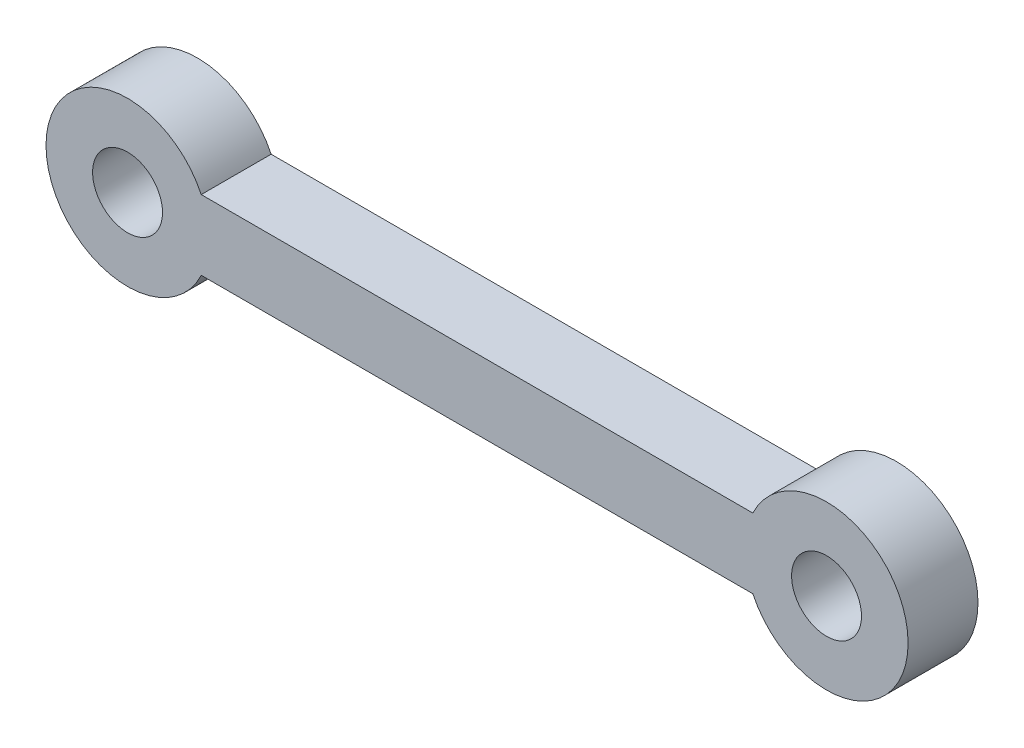
ISO-10303-21;
HEADER;
FILE_DESCRIPTION(('STEP AP214'),'2;1');
FILE_NAME('part.step','',(''),(''),'','','');
FILE_SCHEMA(('AUTOMOTIVE_DESIGN { 1 0 10303 214 1 1 1 1 }'));
ENDSEC;
DATA;
#1=APPLICATION_CONTEXT('core data for automotive mechanical design processes');
#2=APPLICATION_PROTOCOL_DEFINITION('international standard','automotive_design',2000,#1);
#3=PRODUCT_CONTEXT('',#1,'mechanical');
#4=PRODUCT('Part','Part','',(#3));
#5=PRODUCT_RELATED_PRODUCT_CATEGORY('part','',(#4));
#6=PRODUCT_DEFINITION_FORMATION('','',#4);
#7=PRODUCT_DEFINITION_CONTEXT('part definition',#1,'design');
#8=PRODUCT_DEFINITION('design','',#6,#7);
#9=PRODUCT_DEFINITION_SHAPE('','',#8);
#10=(LENGTH_UNIT() NAMED_UNIT(*) SI_UNIT(.MILLI.,.METRE.));
#11=(NAMED_UNIT(*) PLANE_ANGLE_UNIT() SI_UNIT($,.RADIAN.));
#12=(NAMED_UNIT(*) SI_UNIT($,.STERADIAN.) SOLID_ANGLE_UNIT());
#13=UNCERTAINTY_MEASURE_WITH_UNIT(LENGTH_MEASURE(1.E-05),#10,'distance_accuracy_value','');
#14=(GEOMETRIC_REPRESENTATION_CONTEXT(3) GLOBAL_UNCERTAINTY_ASSIGNED_CONTEXT((#13)) GLOBAL_UNIT_ASSIGNED_CONTEXT((#10,
#11,#12)) REPRESENTATION_CONTEXT('',''));
#15=CARTESIAN_POINT('',(0.,0.,0.));
#16=DIRECTION('',(0.,0.,1.));
#17=DIRECTION('',(1.,0.,0.));
#18=AXIS2_PLACEMENT_3D('',#15,#16,#17);
#19=CARTESIAN_POINT('',(0.,0.,3.));
#20=DIRECTION('',(0.,0.,1.));
#21=DIRECTION('',(1.,0.,0.));
#22=AXIS2_PLACEMENT_3D('',#19,#20,#21);
#23=PLANE('',#22);
#24=CARTESIAN_POINT('',(0.,0.,3.));
#25=DIRECTION('',(0.,0.,1.));
#26=DIRECTION('',(1.,0.,0.));
#27=AXIS2_PLACEMENT_3D('',#24,#25,#26);
#28=CIRCLE('',#27,1.5);
#29=CARTESIAN_POINT('',(1.5,0.,3.));
#30=VERTEX_POINT('',#29);
#31=EDGE_CURVE('E101',#30,#30,#28,.T.);
#32=ORIENTED_EDGE('',*,*,#31,.F.);
#33=EDGE_LOOP('',(#32));
#34=FACE_BOUND('',#33,.T.);
#35=CARTESIAN_POINT('',(0.,0.,3.));
#36=DIRECTION('',(0.,0.,1.));
#37=DIRECTION('',(1.,0.,0.));
#38=AXIS2_PLACEMENT_3D('',#35,#36,#37);
#39=CIRCLE('',#38,3.5);
#40=CARTESIAN_POINT('',(3.16227766016838,1.5,3.));
#41=VERTEX_POINT('',#40);
#42=CARTESIAN_POINT('',(3.16227766016838,-1.5,3.));
#43=VERTEX_POINT('',#42);
#44=EDGE_CURVE('E86',#41,#43,#39,.T.);
#45=ORIENTED_EDGE('',*,*,#44,.T.);
#46=DIRECTION('',(1.,0.,0.));
#47=VECTOR('',#46,1.);
#48=CARTESIAN_POINT('',(3.16227766016838,-1.5,3.));
#49=LINE('',#48,#47);
#50=CARTESIAN_POINT('',(26.8377223398316,-1.5,3.));
#51=VERTEX_POINT('',#50);
#52=EDGE_CURVE('E81',#43,#51,#49,.T.);
#53=ORIENTED_EDGE('',*,*,#52,.T.);
#54=CARTESIAN_POINT('',(30.,0.,3.));
#55=DIRECTION('',(0.,0.,1.));
#56=DIRECTION('',(1.,0.,0.));
#57=AXIS2_PLACEMENT_3D('',#54,#55,#56);
#58=CIRCLE('',#57,3.5);
#59=CARTESIAN_POINT('',(26.8377223398316,1.5,3.));
#60=VERTEX_POINT('',#59);
#61=EDGE_CURVE('E84',#51,#60,#58,.T.);
#62=ORIENTED_EDGE('',*,*,#61,.T.);
#63=DIRECTION('',(-1.,0.,0.));
#64=VECTOR('',#63,1.);
#65=CARTESIAN_POINT('',(3.16227766016838,1.5,3.));
#66=LINE('',#65,#64);
#67=EDGE_CURVE('E51',#60,#41,#66,.T.);
#68=ORIENTED_EDGE('',*,*,#67,.T.);
#69=EDGE_LOOP('',(#45,#53,#62,#68));
#70=FACE_BOUND('',#69,.T.);
#71=CARTESIAN_POINT('',(30.,0.,3.));
#72=DIRECTION('',(0.,0.,1.));
#73=DIRECTION('',(1.,0.,0.));
#74=AXIS2_PLACEMENT_3D('',#71,#72,#73);
#75=CIRCLE('',#74,1.5);
#76=CARTESIAN_POINT('',(31.5,0.,3.));
#77=VERTEX_POINT('',#76);
#78=EDGE_CURVE('E116',#77,#77,#75,.T.);
#79=ORIENTED_EDGE('',*,*,#78,.F.);
#80=EDGE_LOOP('',(#79));
#81=FACE_BOUND('',#80,.T.);
#82=ADVANCED_FACE('F34',(#34,#70,#81),#23,.T.);
#83=CARTESIAN_POINT('',(0.,0.,0.));
#84=DIRECTION('',(0.,0.,1.));
#85=DIRECTION('',(1.,0.,0.));
#86=AXIS2_PLACEMENT_3D('',#83,#84,#85);
#87=PLANE('',#86);
#88=CARTESIAN_POINT('',(0.,0.,0.));
#89=DIRECTION('',(0.,0.,1.));
#90=DIRECTION('',(1.,0.,0.));
#91=AXIS2_PLACEMENT_3D('',#88,#89,#90);
#92=CIRCLE('',#91,1.5);
#93=CARTESIAN_POINT('',(1.5,0.,0.));
#94=VERTEX_POINT('',#93);
#95=EDGE_CURVE('E113',#94,#94,#92,.T.);
#96=ORIENTED_EDGE('',*,*,#95,.T.);
#97=EDGE_LOOP('',(#96));
#98=FACE_BOUND('',#97,.T.);
#99=CARTESIAN_POINT('',(0.,0.,0.));
#100=DIRECTION('',(0.,0.,1.));
#101=DIRECTION('',(1.,0.,0.));
#102=AXIS2_PLACEMENT_3D('',#99,#100,#101);
#103=CIRCLE('',#102,3.5);
#104=CARTESIAN_POINT('',(3.16227766016838,1.5,0.));
#105=VERTEX_POINT('',#104);
#106=CARTESIAN_POINT('',(3.16227766016838,-1.5,0.));
#107=VERTEX_POINT('',#106);
#108=EDGE_CURVE('E98',#105,#107,#103,.T.);
#109=ORIENTED_EDGE('',*,*,#108,.F.);
#110=DIRECTION('',(-1.,0.,0.));
#111=VECTOR('',#110,1.);
#112=CARTESIAN_POINT('',(3.16227766016838,1.5,0.));
#113=LINE('',#112,#111);
#114=CARTESIAN_POINT('',(26.8377223398316,1.5,0.));
#115=VERTEX_POINT('',#114);
#116=EDGE_CURVE('E74',#115,#105,#113,.T.);
#117=ORIENTED_EDGE('',*,*,#116,.F.);
#118=CARTESIAN_POINT('',(30.,0.,0.));
#119=DIRECTION('',(0.,0.,1.));
#120=DIRECTION('',(1.,0.,0.));
#121=AXIS2_PLACEMENT_3D('',#118,#119,#120);
#122=CIRCLE('',#121,3.5);
#123=CARTESIAN_POINT('',(26.8377223398316,-1.5,0.));
#124=VERTEX_POINT('',#123);
#125=EDGE_CURVE('E68',#124,#115,#122,.T.);
#126=ORIENTED_EDGE('',*,*,#125,.F.);
#127=DIRECTION('',(1.,0.,0.));
#128=VECTOR('',#127,1.);
#129=CARTESIAN_POINT('',(3.16227766016838,-1.5,0.));
#130=LINE('',#129,#128);
#131=EDGE_CURVE('E90',#107,#124,#130,.T.);
#132=ORIENTED_EDGE('',*,*,#131,.F.);
#133=EDGE_LOOP('',(#109,#117,#126,#132));
#134=FACE_BOUND('',#133,.T.);
#135=CARTESIAN_POINT('',(30.,0.,0.));
#136=DIRECTION('',(0.,0.,1.));
#137=DIRECTION('',(1.,0.,0.));
#138=AXIS2_PLACEMENT_3D('',#135,#136,#137);
#139=CIRCLE('',#138,1.5);
#140=CARTESIAN_POINT('',(31.5,0.,0.));
#141=VERTEX_POINT('',#140);
#142=EDGE_CURVE('E119',#141,#141,#139,.T.);
#143=ORIENTED_EDGE('',*,*,#142,.T.);
#144=EDGE_LOOP('',(#143));
#145=FACE_BOUND('',#144,.T.);
#146=ADVANCED_FACE('F109',(#98,#134,#145),#87,.F.);
#147=CARTESIAN_POINT('',(0.,0.,3.));
#148=DIRECTION('',(0.,0.,-1.));
#149=DIRECTION('',(-1.,0.,0.));
#150=AXIS2_PLACEMENT_3D('',#147,#148,#149);
#151=CYLINDRICAL_SURFACE('',#150,3.5);
#152=ORIENTED_EDGE('',*,*,#108,.T.);
#153=DIRECTION('',(0.,0.,-1.));
#154=VECTOR('',#153,1.);
#155=CARTESIAN_POINT('',(3.16227766016838,-1.5,3.));
#156=LINE('',#155,#154);
#157=EDGE_CURVE('E11',#43,#107,#156,.T.);
#158=ORIENTED_EDGE('',*,*,#157,.F.);
#159=ORIENTED_EDGE('',*,*,#44,.F.);
#160=DIRECTION('',(0.,0.,-1.));
#161=VECTOR('',#160,1.);
#162=CARTESIAN_POINT('',(3.16227766016838,1.5,3.));
#163=LINE('',#162,#161);
#164=EDGE_CURVE('E94',#41,#105,#163,.T.);
#165=ORIENTED_EDGE('',*,*,#164,.T.);
#166=EDGE_LOOP('',(#152,#158,#159,#165));
#167=FACE_BOUND('',#166,.T.);
#168=ADVANCED_FACE('F36',(#167),#151,.T.);
#169=CARTESIAN_POINT('',(3.16227766016838,-1.5,3.));
#170=DIRECTION('',(0.,1.,0.));
#171=DIRECTION('',(0.,0.,1.));
#172=AXIS2_PLACEMENT_3D('',#169,#170,#171);
#173=PLANE('',#172);
#174=ORIENTED_EDGE('',*,*,#131,.T.);
#175=DIRECTION('',(0.,0.,-1.));
#176=VECTOR('',#175,1.);
#177=CARTESIAN_POINT('',(26.8377223398316,-1.5,3.));
#178=LINE('',#177,#176);
#179=EDGE_CURVE('E43',#51,#124,#178,.T.);
#180=ORIENTED_EDGE('',*,*,#179,.F.);
#181=ORIENTED_EDGE('',*,*,#52,.F.);
#182=ORIENTED_EDGE('',*,*,#157,.T.);
#183=EDGE_LOOP('',(#174,#180,#181,#182));
#184=FACE_BOUND('',#183,.T.);
#185=ADVANCED_FACE('F89',(#184),#173,.F.);
#186=CARTESIAN_POINT('',(30.,0.,3.));
#187=DIRECTION('',(0.,0.,-1.));
#188=DIRECTION('',(-1.,0.,0.));
#189=AXIS2_PLACEMENT_3D('',#186,#187,#188);
#190=CYLINDRICAL_SURFACE('',#189,3.5);
#191=ORIENTED_EDGE('',*,*,#125,.T.);
#192=DIRECTION('',(0.,0.,-1.));
#193=VECTOR('',#192,1.);
#194=CARTESIAN_POINT('',(26.8377223398316,1.5,3.));
#195=LINE('',#194,#193);
#196=EDGE_CURVE('E91',#60,#115,#195,.T.);
#197=ORIENTED_EDGE('',*,*,#196,.F.);
#198=ORIENTED_EDGE('',*,*,#61,.F.);
#199=ORIENTED_EDGE('',*,*,#179,.T.);
#200=EDGE_LOOP('',(#191,#197,#198,#199));
#201=FACE_BOUND('',#200,.T.);
#202=ADVANCED_FACE('F92',(#201),#190,.T.);
#203=CARTESIAN_POINT('',(3.16227766016838,1.5,3.));
#204=DIRECTION('',(0.,-1.,0.));
#205=DIRECTION('',(0.,0.,-1.));
#206=AXIS2_PLACEMENT_3D('',#203,#204,#205);
#207=PLANE('',#206);
#208=ORIENTED_EDGE('',*,*,#116,.T.);
#209=ORIENTED_EDGE('',*,*,#164,.F.);
#210=ORIENTED_EDGE('',*,*,#67,.F.);
#211=ORIENTED_EDGE('',*,*,#196,.T.);
#212=EDGE_LOOP('',(#208,#209,#210,#211));
#213=FACE_BOUND('',#212,.T.);
#214=ADVANCED_FACE('F106',(#213),#207,.F.);
#215=CARTESIAN_POINT('',(0.,0.,3.));
#216=DIRECTION('',(0.,0.,-1.));
#217=DIRECTION('',(-1.,0.,0.));
#218=AXIS2_PLACEMENT_3D('',#215,#216,#217);
#219=CYLINDRICAL_SURFACE('',#218,1.5);
#220=ORIENTED_EDGE('',*,*,#31,.T.);
#221=EDGE_LOOP('',(#220));
#222=FACE_BOUND('',#221,.T.);
#223=ORIENTED_EDGE('',*,*,#95,.F.);
#224=EDGE_LOOP('',(#223));
#225=FACE_BOUND('',#224,.T.);
#226=ADVANCED_FACE('F137',(#222,#225),#219,.F.);
#227=CARTESIAN_POINT('',(30.,0.,3.));
#228=DIRECTION('',(0.,0.,-1.));
#229=DIRECTION('',(-1.,0.,0.));
#230=AXIS2_PLACEMENT_3D('',#227,#228,#229);
#231=CYLINDRICAL_SURFACE('',#230,1.5);
#232=ORIENTED_EDGE('',*,*,#78,.T.);
#233=EDGE_LOOP('',(#232));
#234=FACE_BOUND('',#233,.T.);
#235=ORIENTED_EDGE('',*,*,#142,.F.);
#236=EDGE_LOOP('',(#235));
#237=FACE_BOUND('',#236,.T.);
#238=ADVANCED_FACE('F125',(#234,#237),#231,.F.);
#239=CLOSED_SHELL('',(#82,#146,#168,#185,#202,#214,#226,#238));
#240=MANIFOLD_SOLID_BREP('B2',#239);
#241=ADVANCED_BREP_SHAPE_REPRESENTATION('',(#18,#240),#14);
#242=SHAPE_DEFINITION_REPRESENTATION(#9,#241);
ENDSEC;
END-ISO-10303-21;
